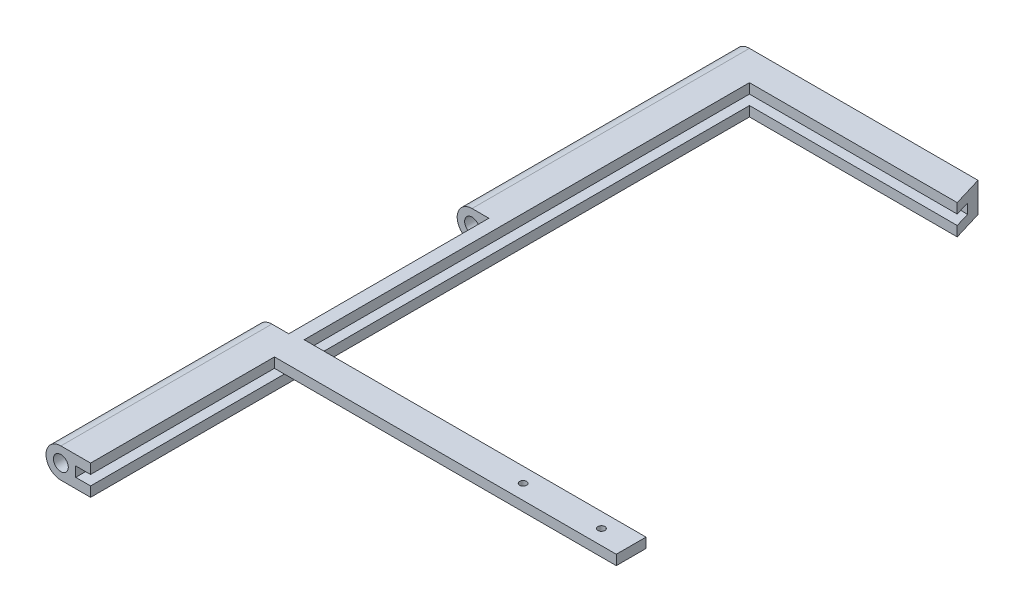
ISO-10303-21;
HEADER;
FILE_DESCRIPTION(('STEP AP214'),'2;1');
FILE_NAME('part.step','',(''),(''),'','','');
FILE_SCHEMA(('AUTOMOTIVE_DESIGN { 1 0 10303 214 1 1 1 1 }'));
ENDSEC;
DATA;
#1=APPLICATION_CONTEXT('core data for automotive mechanical design processes');
#2=APPLICATION_PROTOCOL_DEFINITION('international standard','automotive_design',2000,#1);
#3=PRODUCT_CONTEXT('',#1,'mechanical');
#4=PRODUCT('Part','Part','',(#3));
#5=PRODUCT_RELATED_PRODUCT_CATEGORY('part','',(#4));
#6=PRODUCT_DEFINITION_FORMATION('','',#4);
#7=PRODUCT_DEFINITION_CONTEXT('part definition',#1,'design');
#8=PRODUCT_DEFINITION('design','',#6,#7);
#9=PRODUCT_DEFINITION_SHAPE('','',#8);
#10=(LENGTH_UNIT() NAMED_UNIT(*) SI_UNIT(.MILLI.,.METRE.));
#11=(NAMED_UNIT(*) PLANE_ANGLE_UNIT() SI_UNIT($,.RADIAN.));
#12=(NAMED_UNIT(*) SI_UNIT($,.STERADIAN.) SOLID_ANGLE_UNIT());
#13=UNCERTAINTY_MEASURE_WITH_UNIT(LENGTH_MEASURE(1.E-05),#10,'distance_accuracy_value','');
#14=(GEOMETRIC_REPRESENTATION_CONTEXT(3) GLOBAL_UNCERTAINTY_ASSIGNED_CONTEXT((#13)) GLOBAL_UNIT_ASSIGNED_CONTEXT((#10,
#11,#12)) REPRESENTATION_CONTEXT('',''));
#15=CARTESIAN_POINT('',(0.,0.,0.));
#16=DIRECTION('',(0.,0.,1.));
#17=DIRECTION('',(1.,0.,0.));
#18=AXIS2_PLACEMENT_3D('',#15,#16,#17);
#19=CARTESIAN_POINT('',(0.,0.,3.));
#20=DIRECTION('',(0.,0.,1.));
#21=DIRECTION('',(1.,0.,0.));
#22=AXIS2_PLACEMENT_3D('',#19,#20,#21);
#23=PLANE('',#22);
#24=DIRECTION('',(-1.,0.,0.));
#25=VECTOR('',#24,1.);
#26=CARTESIAN_POINT('',(-0.199999999999998,1.99999999999999,3.));
#27=LINE('',#26,#25);
#28=CARTESIAN_POINT('',(22.2701570676023,2.,3.));
#29=VERTEX_POINT('',#28);
#30=CARTESIAN_POINT('',(1.3,2.,3.));
#31=VERTEX_POINT('',#30);
#32=EDGE_CURVE('E432',#29,#31,#27,.T.);
#33=ORIENTED_EDGE('',*,*,#32,.F.);
#34=DIRECTION('',(0.,1.,0.));
#35=VECTOR('',#34,1.);
#36=CARTESIAN_POINT('',(22.2701570676023,0.,3.));
#37=LINE('',#36,#35);
#38=CARTESIAN_POINT('',(22.2701570676023,3.,3.));
#39=VERTEX_POINT('',#38);
#40=EDGE_CURVE('E305',#29,#39,#37,.T.);
#41=ORIENTED_EDGE('',*,*,#40,.T.);
#42=DIRECTION('',(1.,0.,0.));
#43=VECTOR('',#42,1.);
#44=CARTESIAN_POINT('',(0.,3.,3.));
#45=LINE('',#44,#43);
#46=CARTESIAN_POINT('',(1.3,3.,3.));
#47=VERTEX_POINT('',#46);
#48=EDGE_CURVE('E309',#47,#39,#45,.T.);
#49=ORIENTED_EDGE('',*,*,#48,.F.);
#50=DIRECTION('',(0.,1.,0.));
#51=VECTOR('',#50,1.);
#52=CARTESIAN_POINT('',(1.3,0.,3.));
#53=LINE('',#52,#51);
#54=EDGE_CURVE('E290',#31,#47,#53,.T.);
#55=ORIENTED_EDGE('',*,*,#54,.F.);
#56=EDGE_LOOP('',(#33,#41,#49,#55));
#57=FACE_BOUND('',#56,.T.);
#58=ADVANCED_FACE('F46',(#57),#23,.T.);
#59=CARTESIAN_POINT('',(1.3,0.,0.));
#60=DIRECTION('',(1.,0.,0.));
#61=DIRECTION('',(0.,0.,-1.));
#62=AXIS2_PLACEMENT_3D('',#59,#60,#61);
#63=PLANE('',#62);
#64=DIRECTION('',(0.,0.,-1.));
#65=VECTOR('',#64,1.);
#66=CARTESIAN_POINT('',(1.3,2.,0.));
#67=LINE('',#66,#65);
#68=CARTESIAN_POINT('',(1.3,1.99999999999999,69.5));
#69=VERTEX_POINT('',#68);
#70=CARTESIAN_POINT('',(1.3,1.99999999999999,50.9417859642579));
#71=VERTEX_POINT('',#70);
#72=EDGE_CURVE('E275',#69,#71,#67,.T.);
#73=ORIENTED_EDGE('',*,*,#72,.T.);
#74=DIRECTION('',(0.,-1.,0.));
#75=VECTOR('',#74,1.);
#76=CARTESIAN_POINT('',(1.3,3.,50.9417859642579));
#77=LINE('',#76,#75);
#78=CARTESIAN_POINT('',(1.3,3.,50.9417859642579));
#79=VERTEX_POINT('',#78);
#80=EDGE_CURVE('E246',#79,#71,#77,.T.);
#81=ORIENTED_EDGE('',*,*,#80,.F.);
#82=DIRECTION('',(0.,0.,-1.));
#83=VECTOR('',#82,1.);
#84=CARTESIAN_POINT('',(1.3,3.,0.));
#85=LINE('',#84,#83);
#86=CARTESIAN_POINT('',(1.3,3.,69.5));
#87=VERTEX_POINT('',#86);
#88=EDGE_CURVE('E298',#87,#79,#85,.T.);
#89=ORIENTED_EDGE('',*,*,#88,.F.);
#90=DIRECTION('',(0.,1.,0.));
#91=VECTOR('',#90,1.);
#92=CARTESIAN_POINT('',(1.3,0.,69.5));
#93=LINE('',#92,#91);
#94=EDGE_CURVE('E217',#69,#87,#93,.T.);
#95=ORIENTED_EDGE('',*,*,#94,.F.);
#96=EDGE_LOOP('',(#73,#81,#89,#95));
#97=FACE_BOUND('',#96,.T.);
#98=ADVANCED_FACE('F416',(#97),#63,.T.);
#99=CARTESIAN_POINT('',(1.3,3.,47.9417859642579));
#100=VERTEX_POINT('',#99);
#101=EDGE_CURVE('E68',#100,#47,#85,.T.);
#102=ORIENTED_EDGE('',*,*,#101,.F.);
#103=DIRECTION('',(0.,1.,0.));
#104=VECTOR('',#103,1.);
#105=CARTESIAN_POINT('',(1.3,3.,47.9417859642579));
#106=LINE('',#105,#104);
#107=CARTESIAN_POINT('',(1.3,1.99999999999999,47.9417859642579));
#108=VERTEX_POINT('',#107);
#109=EDGE_CURVE('E233',#108,#100,#106,.T.);
#110=ORIENTED_EDGE('',*,*,#109,.F.);
#111=EDGE_CURVE('E274',#108,#31,#67,.T.);
#112=ORIENTED_EDGE('',*,*,#111,.T.);
#113=ORIENTED_EDGE('',*,*,#54,.T.);
#114=EDGE_LOOP('',(#102,#110,#112,#113));
#115=FACE_BOUND('',#114,.T.);
#116=ADVANCED_FACE('F449',(#115),#63,.T.);
#117=CARTESIAN_POINT('',(0.,0.,48.2));
#118=DIRECTION('',(0.,0.,-1.));
#119=DIRECTION('',(-1.,0.,0.));
#120=AXIS2_PLACEMENT_3D('',#117,#118,#119);
#121=PLANE('',#120);
#122=CARTESIAN_POINT('',(-1.7,1.5,48.2));
#123=DIRECTION('',(0.,0.,-1.));
#124=DIRECTION('',(-1.,0.,0.));
#125=AXIS2_PLACEMENT_3D('',#122,#123,#124);
#126=CIRCLE('',#125,0.75);
#127=CARTESIAN_POINT('',(-2.45,1.5,48.2));
#128=VERTEX_POINT('',#127);
#129=EDGE_CURVE('E345',#128,#128,#126,.F.);
#130=ORIENTED_EDGE('',*,*,#129,.T.);
#131=EDGE_LOOP('',(#130));
#132=FACE_BOUND('',#131,.T.);
#133=DIRECTION('',(0.,1.,0.));
#134=VECTOR('',#133,1.);
#135=CARTESIAN_POINT('',(0.,0.,48.2));
#136=LINE('',#135,#134);
#137=CARTESIAN_POINT('',(0.,1.99999999999999,48.2));
#138=VERTEX_POINT('',#137);
#139=CARTESIAN_POINT('',(0.,3.,48.2));
#140=VERTEX_POINT('',#139);
#141=EDGE_CURVE('E327',#138,#140,#136,.T.);
#142=ORIENTED_EDGE('',*,*,#141,.F.);
#143=DIRECTION('',(-1.,0.,0.));
#144=VECTOR('',#143,1.);
#145=CARTESIAN_POINT('',(0.,1.99999999999999,48.2));
#146=LINE('',#145,#144);
#147=CARTESIAN_POINT('',(-0.199999999999999,1.99999999999999,48.2));
#148=VERTEX_POINT('',#147);
#149=EDGE_CURVE('E262',#138,#148,#146,.T.);
#150=ORIENTED_EDGE('',*,*,#149,.T.);
#151=DIRECTION('',(0.,-1.,0.));
#152=VECTOR('',#151,1.);
#153=CARTESIAN_POINT('',(-0.199999999999999,0.,48.2));
#154=LINE('',#153,#152);
#155=CARTESIAN_POINT('',(-0.199999999999999,0.999999999999994,48.2));
#156=VERTEX_POINT('',#155);
#157=EDGE_CURVE('E265',#148,#156,#154,.T.);
#158=ORIENTED_EDGE('',*,*,#157,.T.);
#159=DIRECTION('',(-1.,0.,0.));
#160=VECTOR('',#159,1.);
#161=CARTESIAN_POINT('',(0.,0.999999999999994,48.2));
#162=LINE('',#161,#160);
#163=CARTESIAN_POINT('',(0.,0.999999999999994,48.2));
#164=VERTEX_POINT('',#163);
#165=EDGE_CURVE('E260',#164,#156,#162,.T.);
#166=ORIENTED_EDGE('',*,*,#165,.F.);
#167=CARTESIAN_POINT('',(0.,0.,48.2));
#168=VERTEX_POINT('',#167);
#169=EDGE_CURVE('E335',#168,#164,#136,.T.);
#170=ORIENTED_EDGE('',*,*,#169,.F.);
#171=DIRECTION('',(-1.,0.,0.));
#172=VECTOR('',#171,1.);
#173=CARTESIAN_POINT('',(0.,0.,48.2));
#174=LINE('',#173,#172);
#175=CARTESIAN_POINT('',(-1.7,0.,48.2));
#176=VERTEX_POINT('',#175);
#177=EDGE_CURVE('E317',#168,#176,#174,.T.);
#178=ORIENTED_EDGE('',*,*,#177,.T.);
#179=CARTESIAN_POINT('',(-1.7,1.5,48.2));
#180=DIRECTION('',(0.,0.,-1.));
#181=DIRECTION('',(-1.,0.,0.));
#182=AXIS2_PLACEMENT_3D('',#179,#180,#181);
#183=CIRCLE('',#182,1.5);
#184=CARTESIAN_POINT('',(-1.7,3.,48.2));
#185=VERTEX_POINT('',#184);
#186=EDGE_CURVE('E346',#185,#176,#183,.F.);
#187=ORIENTED_EDGE('',*,*,#186,.F.);
#188=DIRECTION('',(-1.,0.,0.));
#189=VECTOR('',#188,1.);
#190=CARTESIAN_POINT('',(0.,3.,48.2));
#191=LINE('',#190,#189);
#192=EDGE_CURVE('E294',#140,#185,#191,.T.);
#193=ORIENTED_EDGE('',*,*,#192,.F.);
#194=EDGE_LOOP('',(#142,#150,#158,#166,#170,#178,#187,#193));
#195=FACE_BOUND('',#194,.T.);
#196=ADVANCED_FACE('F476',(#132,#195),#121,.T.);
#197=CARTESIAN_POINT('',(0.,0.,48.2));
#198=DIRECTION('',(1.,0.,0.));
#199=DIRECTION('',(0.,0.,-1.));
#200=AXIS2_PLACEMENT_3D('',#197,#198,#199);
#201=PLANE('',#200);
#202=DIRECTION('',(0.,0.,-1.));
#203=VECTOR('',#202,1.);
#204=CARTESIAN_POINT('',(0.,1.99999999999999,48.2));
#205=LINE('',#204,#203);
#206=CARTESIAN_POINT('',(0.,2.,28.));
#207=VERTEX_POINT('',#206);
#208=EDGE_CURVE('E277',#138,#207,#205,.T.);
#209=ORIENTED_EDGE('',*,*,#208,.F.);
#210=ORIENTED_EDGE('',*,*,#141,.T.);
#211=DIRECTION('',(0.,0.,-1.));
#212=VECTOR('',#211,1.);
#213=CARTESIAN_POINT('',(0.,3.,48.2));
#214=LINE('',#213,#212);
#215=CARTESIAN_POINT('',(0.,3.,28.));
#216=VERTEX_POINT('',#215);
#217=EDGE_CURVE('E321',#140,#216,#214,.T.);
#218=ORIENTED_EDGE('',*,*,#217,.T.);
#219=DIRECTION('',(0.,1.,0.));
#220=VECTOR('',#219,1.);
#221=CARTESIAN_POINT('',(0.,0.,28.));
#222=LINE('',#221,#220);
#223=EDGE_CURVE('E338',#207,#216,#222,.T.);
#224=ORIENTED_EDGE('',*,*,#223,.F.);
#225=EDGE_LOOP('',(#209,#210,#218,#224));
#226=FACE_BOUND('',#225,.T.);
#227=ADVANCED_FACE('F472',(#226),#201,.F.);
#228=CARTESIAN_POINT('',(38.8,0.,69.5));
#229=DIRECTION('',(0.,0.,-1.));
#230=DIRECTION('',(-1.,0.,0.));
#231=AXIS2_PLACEMENT_3D('',#228,#229,#230);
#232=PLANE('',#231);
#233=CARTESIAN_POINT('',(-1.7,1.5,69.5));
#234=DIRECTION('',(0.,0.,-1.));
#235=DIRECTION('',(-1.,0.,0.));
#236=AXIS2_PLACEMENT_3D('',#233,#234,#235);
#237=CIRCLE('',#236,0.75);
#238=CARTESIAN_POINT('',(-2.45,1.5,69.5));
#239=VERTEX_POINT('',#238);
#240=EDGE_CURVE('E348',#239,#239,#237,.F.);
#241=ORIENTED_EDGE('',*,*,#240,.F.);
#242=EDGE_LOOP('',(#241));
#243=FACE_BOUND('',#242,.T.);
#244=DIRECTION('',(-1.,0.,0.));
#245=VECTOR('',#244,1.);
#246=CARTESIAN_POINT('',(60.8227155455453,1.99999999999999,69.5));
#247=LINE('',#246,#245);
#248=CARTESIAN_POINT('',(-0.199999999999998,1.99999999999999,69.5));
#249=VERTEX_POINT('',#248);
#250=EDGE_CURVE('E257',#69,#249,#247,.T.);
#251=ORIENTED_EDGE('',*,*,#250,.F.);
#252=ORIENTED_EDGE('',*,*,#94,.T.);
#253=DIRECTION('',(-1.,0.,0.));
#254=VECTOR('',#253,1.);
#255=CARTESIAN_POINT('',(38.8,3.,69.5));
#256=LINE('',#255,#254);
#257=CARTESIAN_POINT('',(-1.7,3.,69.5));
#258=VERTEX_POINT('',#257);
#259=EDGE_CURVE('E291',#87,#258,#256,.T.);
#260=ORIENTED_EDGE('',*,*,#259,.T.);
#261=CARTESIAN_POINT('',(-1.7,1.5,69.5));
#262=DIRECTION('',(0.,0.,-1.));
#263=DIRECTION('',(-1.,0.,0.));
#264=AXIS2_PLACEMENT_3D('',#261,#262,#263);
#265=CIRCLE('',#264,1.5);
#266=CARTESIAN_POINT('',(-1.7,0.,69.5));
#267=VERTEX_POINT('',#266);
#268=EDGE_CURVE('E349',#258,#267,#265,.F.);
#269=ORIENTED_EDGE('',*,*,#268,.T.);
#270=DIRECTION('',(-1.,0.,0.));
#271=VECTOR('',#270,1.);
#272=CARTESIAN_POINT('',(38.8,0.,69.5));
#273=LINE('',#272,#271);
#274=CARTESIAN_POINT('',(1.3,0.,69.5));
#275=VERTEX_POINT('',#274);
#276=EDGE_CURVE('E295',#275,#267,#273,.T.);
#277=ORIENTED_EDGE('',*,*,#276,.F.);
#278=CARTESIAN_POINT('',(1.3,0.999999999999995,69.5));
#279=VERTEX_POINT('',#278);
#280=EDGE_CURVE('E299',#275,#279,#93,.T.);
#281=ORIENTED_EDGE('',*,*,#280,.T.);
#282=DIRECTION('',(-1.,0.,0.));
#283=VECTOR('',#282,1.);
#284=CARTESIAN_POINT('',(60.8227155455453,0.999999999999995,69.5));
#285=LINE('',#284,#283);
#286=CARTESIAN_POINT('',(-0.199999999999998,0.999999999999995,69.5));
#287=VERTEX_POINT('',#286);
#288=EDGE_CURVE('E254',#279,#287,#285,.T.);
#289=ORIENTED_EDGE('',*,*,#288,.T.);
#290=DIRECTION('',(0.,-1.,0.));
#291=VECTOR('',#290,1.);
#292=CARTESIAN_POINT('',(-0.199999999999998,0.,69.5));
#293=LINE('',#292,#291);
#294=EDGE_CURVE('E249',#249,#287,#293,.T.);
#295=ORIENTED_EDGE('',*,*,#294,.F.);
#296=EDGE_LOOP('',(#251,#252,#260,#269,#277,#281,#289,#295));
#297=FACE_BOUND('',#296,.T.);
#298=ADVANCED_FACE('F423',(#243,#297),#232,.F.);
#299=CARTESIAN_POINT('',(0.,3.,0.));
#300=DIRECTION('',(0.,1.,0.));
#301=DIRECTION('',(0.,0.,1.));
#302=AXIS2_PLACEMENT_3D('',#299,#300,#301);
#303=PLANE('',#302);
#304=DIRECTION('',(0.,0.,1.));
#305=VECTOR('',#304,1.);
#306=CARTESIAN_POINT('',(35.8,3.,47.9417859642579));
#307=LINE('',#306,#305);
#308=CARTESIAN_POINT('',(35.8,3.,47.9417859642579));
#309=VERTEX_POINT('',#308);
#310=CARTESIAN_POINT('',(35.8,3.,50.9417859642579));
#311=VERTEX_POINT('',#310);
#312=EDGE_CURVE('E209',#309,#311,#307,.T.);
#313=ORIENTED_EDGE('',*,*,#312,.F.);
#314=DIRECTION('',(1.,0.,0.));
#315=VECTOR('',#314,1.);
#316=CARTESIAN_POINT('',(-1.86227766016838,3.,47.9417859642579));
#317=LINE('',#316,#315);
#318=EDGE_CURVE('E224',#100,#309,#317,.T.);
#319=ORIENTED_EDGE('',*,*,#318,.F.);
#320=ORIENTED_EDGE('',*,*,#101,.T.);
#321=ORIENTED_EDGE('',*,*,#48,.T.);
#322=DIRECTION('',(0.288272472485392,0.,0.957548422591337));
#323=VECTOR('',#322,1.);
#324=CARTESIAN_POINT('',(20.3323729813987,3.,-3.43669539123599));
#325=LINE('',#324,#323);
#326=CARTESIAN_POINT('',(21.3669991728655,3.,0.));
#327=VERTEX_POINT('',#326);
#328=EDGE_CURVE('E230',#327,#39,#325,.T.);
#329=ORIENTED_EDGE('',*,*,#328,.F.);
#330=DIRECTION('',(-1.,0.,0.));
#331=VECTOR('',#330,1.);
#332=CARTESIAN_POINT('',(24.5,3.,0.));
#333=LINE('',#332,#331);
#334=CARTESIAN_POINT('',(-1.7,3.,0.));
#335=VERTEX_POINT('',#334);
#336=EDGE_CURVE('E365',#327,#335,#333,.T.);
#337=ORIENTED_EDGE('',*,*,#336,.T.);
#338=DIRECTION('',(0.,0.,-1.));
#339=VECTOR('',#338,1.);
#340=CARTESIAN_POINT('',(-1.7,3.,77.3863424398923));
#341=LINE('',#340,#339);
#342=CARTESIAN_POINT('',(-1.7,3.,28.));
#343=VERTEX_POINT('',#342);
#344=EDGE_CURVE('E358',#343,#335,#341,.T.);
#345=ORIENTED_EDGE('',*,*,#344,.F.);
#346=DIRECTION('',(-1.,0.,0.));
#347=VECTOR('',#346,1.);
#348=CARTESIAN_POINT('',(0.,3.,28.));
#349=LINE('',#348,#347);
#350=EDGE_CURVE('E330',#216,#343,#349,.T.);
#351=ORIENTED_EDGE('',*,*,#350,.F.);
#352=ORIENTED_EDGE('',*,*,#217,.F.);
#353=ORIENTED_EDGE('',*,*,#192,.T.);
#354=EDGE_CURVE('E361',#258,#185,#341,.T.);
#355=ORIENTED_EDGE('',*,*,#354,.F.);
#356=ORIENTED_EDGE('',*,*,#259,.F.);
#357=ORIENTED_EDGE('',*,*,#88,.T.);
#358=DIRECTION('',(1.,0.,0.));
#359=VECTOR('',#358,1.);
#360=CARTESIAN_POINT('',(-1.86227766016838,3.,50.9417859642579));
#361=LINE('',#360,#359);
#362=EDGE_CURVE('E227',#79,#311,#361,.T.);
#363=ORIENTED_EDGE('',*,*,#362,.T.);
#364=EDGE_LOOP('',(#313,#319,#320,#321,#329,#337,#345,#351,#352,#353,#355,#356,#357,#363));
#365=FACE_BOUND('',#364,.T.);
#366=CARTESIAN_POINT('',(32.8,3.,49.4417859642579));
#367=DIRECTION('',(0.,1.,0.));
#368=DIRECTION('',(0.,0.,1.));
#369=AXIS2_PLACEMENT_3D('',#366,#367,#368);
#370=CIRCLE('',#369,0.350000000000002);
#371=CARTESIAN_POINT('',(32.8,3.,49.7917859642579));
#372=VERTEX_POINT('',#371);
#373=EDGE_CURVE('E378',#372,#372,#370,.T.);
#374=ORIENTED_EDGE('',*,*,#373,.F.);
#375=EDGE_LOOP('',(#374));
#376=FACE_BOUND('',#375,.T.);
#377=CARTESIAN_POINT('',(24.9,3.,49.4417859642579));
#378=DIRECTION('',(0.,1.,0.));
#379=DIRECTION('',(0.,0.,1.));
#380=AXIS2_PLACEMENT_3D('',#377,#378,#379);
#381=CIRCLE('',#380,0.350000000000008);
#382=CARTESIAN_POINT('',(24.9,3.,49.7917859642579));
#383=VERTEX_POINT('',#382);
#384=EDGE_CURVE('E400',#383,#383,#381,.T.);
#385=ORIENTED_EDGE('',*,*,#384,.F.);
#386=EDGE_LOOP('',(#385));
#387=FACE_BOUND('',#386,.T.);
#388=ADVANCED_FACE('F222',(#365,#376,#387),#303,.T.);
#389=CARTESIAN_POINT('',(0.,0.,0.));
#390=DIRECTION('',(0.,1.,0.));
#391=DIRECTION('',(0.,0.,1.));
#392=AXIS2_PLACEMENT_3D('',#389,#390,#391);
#393=PLANE('',#392);
#394=DIRECTION('',(-1.,0.,0.));
#395=VECTOR('',#394,1.);
#396=CARTESIAN_POINT('',(24.5,0.,0.));
#397=LINE('',#396,#395);
#398=CARTESIAN_POINT('',(21.3669991728655,0.,0.));
#399=VERTEX_POINT('',#398);
#400=CARTESIAN_POINT('',(-1.7,0.,0.));
#401=VERTEX_POINT('',#400);
#402=EDGE_CURVE('E367',#399,#401,#397,.T.);
#403=ORIENTED_EDGE('',*,*,#402,.F.);
#404=DIRECTION('',(0.288272472485392,0.,0.957548422591337));
#405=VECTOR('',#404,1.);
#406=CARTESIAN_POINT('',(20.3323729813987,0.,-3.43669539123599));
#407=LINE('',#406,#405);
#408=CARTESIAN_POINT('',(22.2701570676023,0.,3.));
#409=VERTEX_POINT('',#408);
#410=EDGE_CURVE('E229',#399,#409,#407,.T.);
#411=ORIENTED_EDGE('',*,*,#410,.T.);
#412=DIRECTION('',(1.,0.,0.));
#413=VECTOR('',#412,1.);
#414=CARTESIAN_POINT('',(0.,0.,3.));
#415=LINE('',#414,#413);
#416=CARTESIAN_POINT('',(1.3,0.,3.));
#417=VERTEX_POINT('',#416);
#418=EDGE_CURVE('E301',#417,#409,#415,.T.);
#419=ORIENTED_EDGE('',*,*,#418,.F.);
#420=DIRECTION('',(0.,0.,-1.));
#421=VECTOR('',#420,1.);
#422=CARTESIAN_POINT('',(1.3,0.,0.));
#423=LINE('',#422,#421);
#424=EDGE_CURVE('E312',#275,#417,#423,.T.);
#425=ORIENTED_EDGE('',*,*,#424,.F.);
#426=ORIENTED_EDGE('',*,*,#276,.T.);
#427=DIRECTION('',(0.,0.,-1.));
#428=VECTOR('',#427,1.);
#429=CARTESIAN_POINT('',(-1.7,0.,77.3863424398923));
#430=LINE('',#429,#428);
#431=EDGE_CURVE('E362',#267,#176,#430,.T.);
#432=ORIENTED_EDGE('',*,*,#431,.T.);
#433=ORIENTED_EDGE('',*,*,#177,.F.);
#434=DIRECTION('',(0.,0.,-1.));
#435=VECTOR('',#434,1.);
#436=CARTESIAN_POINT('',(0.,0.,48.2));
#437=LINE('',#436,#435);
#438=CARTESIAN_POINT('',(0.,0.,28.));
#439=VERTEX_POINT('',#438);
#440=EDGE_CURVE('E324',#168,#439,#437,.T.);
#441=ORIENTED_EDGE('',*,*,#440,.T.);
#442=DIRECTION('',(-1.,0.,0.));
#443=VECTOR('',#442,1.);
#444=CARTESIAN_POINT('',(0.,0.,28.));
#445=LINE('',#444,#443);
#446=CARTESIAN_POINT('',(-1.7,0.,28.));
#447=VERTEX_POINT('',#446);
#448=EDGE_CURVE('E320',#439,#447,#445,.T.);
#449=ORIENTED_EDGE('',*,*,#448,.T.);
#450=EDGE_CURVE('E357',#447,#401,#430,.T.);
#451=ORIENTED_EDGE('',*,*,#450,.T.);
#452=EDGE_LOOP('',(#403,#411,#419,#425,#426,#432,#433,#441,#449,#451));
#453=FACE_BOUND('',#452,.T.);
#454=ADVANCED_FACE('F483',(#453),#393,.F.);
#455=CARTESIAN_POINT('',(-1.7,1.5,77.3863424398923));
#456=DIRECTION('',(0.,0.,-1.));
#457=DIRECTION('',(-1.,0.,0.));
#458=AXIS2_PLACEMENT_3D('',#455,#456,#457);
#459=CYLINDRICAL_SURFACE('',#458,1.5);
#460=ORIENTED_EDGE('',*,*,#268,.F.);
#461=ORIENTED_EDGE('',*,*,#354,.T.);
#462=ORIENTED_EDGE('',*,*,#186,.T.);
#463=ORIENTED_EDGE('',*,*,#431,.F.);
#464=EDGE_LOOP('',(#460,#461,#462,#463));
#465=FACE_BOUND('',#464,.T.);
#466=ADVANCED_FACE('F478',(#465),#459,.T.);
#467=CARTESIAN_POINT('',(24.5,3.,0.));
#468=DIRECTION('',(0.,0.,1.));
#469=DIRECTION('',(1.,0.,0.));
#470=AXIS2_PLACEMENT_3D('',#467,#468,#469);
#471=PLANE('',#470);
#472=ORIENTED_EDGE('',*,*,#336,.F.);
#473=DIRECTION('',(0.,-1.,0.));
#474=VECTOR('',#473,1.);
#475=CARTESIAN_POINT('',(21.3669991728655,3.,0.));
#476=LINE('',#475,#474);
#477=EDGE_CURVE('E429',#327,#399,#476,.T.);
#478=ORIENTED_EDGE('',*,*,#477,.T.);
#479=ORIENTED_EDGE('',*,*,#402,.T.);
#480=CARTESIAN_POINT('',(-1.7,1.5,0.));
#481=DIRECTION('',(0.,0.,-1.));
#482=DIRECTION('',(-1.,0.,0.));
#483=AXIS2_PLACEMENT_3D('',#480,#481,#482);
#484=CIRCLE('',#483,1.5);
#485=EDGE_CURVE('E351',#401,#335,#484,.T.);
#486=ORIENTED_EDGE('',*,*,#485,.T.);
#487=EDGE_LOOP('',(#472,#478,#479,#486));
#488=FACE_BOUND('',#487,.T.);
#489=CARTESIAN_POINT('',(-1.7,1.5,0.));
#490=DIRECTION('',(0.,0.,-1.));
#491=DIRECTION('',(-1.,0.,0.));
#492=AXIS2_PLACEMENT_3D('',#489,#490,#491);
#493=CIRCLE('',#492,0.75);
#494=CARTESIAN_POINT('',(-2.45,1.5,0.));
#495=VERTEX_POINT('',#494);
#496=EDGE_CURVE('E354',#495,#495,#493,.T.);
#497=ORIENTED_EDGE('',*,*,#496,.F.);
#498=EDGE_LOOP('',(#497));
#499=FACE_BOUND('',#498,.T.);
#500=ADVANCED_FACE('F48',(#488,#499),#471,.F.);
#501=CARTESIAN_POINT('',(-1.7,1.5,28.));
#502=DIRECTION('',(0.,0.,-1.));
#503=DIRECTION('',(-1.,0.,0.));
#504=AXIS2_PLACEMENT_3D('',#501,#502,#503);
#505=CIRCLE('',#504,1.5);
#506=EDGE_CURVE('E343',#343,#447,#505,.F.);
#507=ORIENTED_EDGE('',*,*,#506,.F.);
#508=ORIENTED_EDGE('',*,*,#344,.T.);
#509=ORIENTED_EDGE('',*,*,#485,.F.);
#510=ORIENTED_EDGE('',*,*,#450,.F.);
#511=EDGE_LOOP('',(#507,#508,#509,#510));
#512=FACE_BOUND('',#511,.T.);
#513=ADVANCED_FACE('F461',(#512),#459,.T.);
#514=CARTESIAN_POINT('',(-1.7,1.5,77.3863424398923));
#515=DIRECTION('',(0.,0.,-1.));
#516=DIRECTION('',(-1.,0.,0.));
#517=AXIS2_PLACEMENT_3D('',#514,#515,#516);
#518=CYLINDRICAL_SURFACE('',#517,0.75);
#519=CARTESIAN_POINT('',(-1.7,1.5,28.));
#520=DIRECTION('',(0.,0.,-1.));
#521=DIRECTION('',(-1.,0.,0.));
#522=AXIS2_PLACEMENT_3D('',#519,#520,#521);
#523=CIRCLE('',#522,0.75);
#524=CARTESIAN_POINT('',(-2.45,1.5,28.));
#525=VERTEX_POINT('',#524);
#526=EDGE_CURVE('E342',#525,#525,#523,.F.);
#527=ORIENTED_EDGE('',*,*,#526,.T.);
#528=EDGE_LOOP('',(#527));
#529=FACE_BOUND('',#528,.T.);
#530=ORIENTED_EDGE('',*,*,#496,.T.);
#531=EDGE_LOOP('',(#530));
#532=FACE_BOUND('',#531,.T.);
#533=ADVANCED_FACE('F543',(#529,#532),#518,.F.);
#534=CARTESIAN_POINT('',(0.,0.,28.));
#535=DIRECTION('',(0.,0.,-1.));
#536=DIRECTION('',(-1.,0.,0.));
#537=AXIS2_PLACEMENT_3D('',#534,#535,#536);
#538=PLANE('',#537);
#539=CARTESIAN_POINT('',(0.,0.999999999999996,28.));
#540=VERTEX_POINT('',#539);
#541=EDGE_CURVE('E339',#439,#540,#222,.T.);
#542=ORIENTED_EDGE('',*,*,#541,.T.);
#543=DIRECTION('',(-1.,0.,0.));
#544=VECTOR('',#543,1.);
#545=CARTESIAN_POINT('',(0.,0.999999999999996,28.));
#546=LINE('',#545,#544);
#547=CARTESIAN_POINT('',(-0.199999999999999,0.999999999999996,28.));
#548=VERTEX_POINT('',#547);
#549=EDGE_CURVE('E287',#540,#548,#546,.T.);
#550=ORIENTED_EDGE('',*,*,#549,.T.);
#551=DIRECTION('',(0.,-1.,0.));
#552=VECTOR('',#551,1.);
#553=CARTESIAN_POINT('',(-0.199999999999999,0.,28.));
#554=LINE('',#553,#552);
#555=CARTESIAN_POINT('',(-0.199999999999999,2.,28.));
#556=VERTEX_POINT('',#555);
#557=EDGE_CURVE('E54',#556,#548,#554,.T.);
#558=ORIENTED_EDGE('',*,*,#557,.F.);
#559=DIRECTION('',(-1.,0.,0.));
#560=VECTOR('',#559,1.);
#561=CARTESIAN_POINT('',(0.,2.,28.));
#562=LINE('',#561,#560);
#563=EDGE_CURVE('E279',#207,#556,#562,.T.);
#564=ORIENTED_EDGE('',*,*,#563,.F.);
#565=ORIENTED_EDGE('',*,*,#223,.T.);
#566=ORIENTED_EDGE('',*,*,#350,.T.);
#567=ORIENTED_EDGE('',*,*,#506,.T.);
#568=ORIENTED_EDGE('',*,*,#448,.F.);
#569=EDGE_LOOP('',(#542,#550,#558,#564,#565,#566,#567,#568));
#570=FACE_BOUND('',#569,.T.);
#571=ORIENTED_EDGE('',*,*,#526,.F.);
#572=EDGE_LOOP('',(#571));
#573=FACE_BOUND('',#572,.T.);
#574=ADVANCED_FACE('F465',(#570,#573),#538,.F.);
#575=ORIENTED_EDGE('',*,*,#169,.T.);
#576=DIRECTION('',(0.,0.,-1.));
#577=VECTOR('',#576,1.);
#578=CARTESIAN_POINT('',(0.,0.999999999999994,48.2));
#579=LINE('',#578,#577);
#580=EDGE_CURVE('E284',#164,#540,#579,.T.);
#581=ORIENTED_EDGE('',*,*,#580,.T.);
#582=ORIENTED_EDGE('',*,*,#541,.F.);
#583=ORIENTED_EDGE('',*,*,#440,.F.);
#584=EDGE_LOOP('',(#575,#581,#582,#583));
#585=FACE_BOUND('',#584,.T.);
#586=ADVANCED_FACE('F500',(#585),#201,.F.);
#587=ORIENTED_EDGE('',*,*,#240,.T.);
#588=EDGE_LOOP('',(#587));
#589=FACE_BOUND('',#588,.T.);
#590=ORIENTED_EDGE('',*,*,#129,.F.);
#591=EDGE_LOOP('',(#590));
#592=FACE_BOUND('',#591,.T.);
#593=ADVANCED_FACE('F536',(#589,#592),#518,.F.);
#594=DIRECTION('',(0.,0.,-1.));
#595=VECTOR('',#594,1.);
#596=CARTESIAN_POINT('',(1.3,1.,0.));
#597=LINE('',#596,#595);
#598=CARTESIAN_POINT('',(1.3,0.999999999999995,3.));
#599=VERTEX_POINT('',#598);
#600=EDGE_CURVE('E281',#279,#599,#597,.T.);
#601=ORIENTED_EDGE('',*,*,#600,.F.);
#602=ORIENTED_EDGE('',*,*,#280,.F.);
#603=ORIENTED_EDGE('',*,*,#424,.T.);
#604=EDGE_CURVE('E306',#417,#599,#53,.T.);
#605=ORIENTED_EDGE('',*,*,#604,.T.);
#606=EDGE_LOOP('',(#601,#602,#603,#605));
#607=FACE_BOUND('',#606,.T.);
#608=ADVANCED_FACE('F488',(#607),#63,.T.);
#609=DIRECTION('',(1.,0.,0.));
#610=VECTOR('',#609,1.);
#611=CARTESIAN_POINT('',(-0.199999999999998,0.999999999999995,3.));
#612=LINE('',#611,#610);
#613=CARTESIAN_POINT('',(22.2701570676023,0.999999999999998,3.));
#614=VERTEX_POINT('',#613);
#615=EDGE_CURVE('E428',#599,#614,#612,.T.);
#616=ORIENTED_EDGE('',*,*,#615,.F.);
#617=ORIENTED_EDGE('',*,*,#604,.F.);
#618=ORIENTED_EDGE('',*,*,#418,.T.);
#619=EDGE_CURVE('E218',#409,#614,#37,.T.);
#620=ORIENTED_EDGE('',*,*,#619,.T.);
#621=EDGE_LOOP('',(#616,#617,#618,#620));
#622=FACE_BOUND('',#621,.T.);
#623=ADVANCED_FACE('F505',(#622),#23,.T.);
#624=CARTESIAN_POINT('',(-0.200000000000001,0.,0.));
#625=DIRECTION('',(1.,0.,0.));
#626=DIRECTION('',(0.,0.,-1.));
#627=AXIS2_PLACEMENT_3D('',#624,#625,#626);
#628=PLANE('',#627);
#629=ORIENTED_EDGE('',*,*,#557,.T.);
#630=DIRECTION('',(0.,0.,1.));
#631=VECTOR('',#630,1.);
#632=CARTESIAN_POINT('',(-0.200000000000001,1.,0.));
#633=LINE('',#632,#631);
#634=CARTESIAN_POINT('',(-0.199999999999998,0.999999999999995,1.5));
#635=VERTEX_POINT('',#634);
#636=EDGE_CURVE('E271',#635,#548,#633,.T.);
#637=ORIENTED_EDGE('',*,*,#636,.F.);
#638=DIRECTION('',(0.,-1.,0.));
#639=VECTOR('',#638,1.);
#640=CARTESIAN_POINT('',(-0.199999999999998,1.99999999999999,1.5));
#641=LINE('',#640,#639);
#642=CARTESIAN_POINT('',(-0.199999999999998,1.99999999999999,1.5));
#643=VERTEX_POINT('',#642);
#644=EDGE_CURVE('E439',#643,#635,#641,.T.);
#645=ORIENTED_EDGE('',*,*,#644,.F.);
#646=DIRECTION('',(0.,0.,1.));
#647=VECTOR('',#646,1.);
#648=CARTESIAN_POINT('',(-0.200000000000001,2.,0.));
#649=LINE('',#648,#647);
#650=EDGE_CURVE('E268',#643,#556,#649,.T.);
#651=ORIENTED_EDGE('',*,*,#650,.T.);
#652=EDGE_LOOP('',(#629,#637,#645,#651));
#653=FACE_BOUND('',#652,.T.);
#654=ADVANCED_FACE('F497',(#653),#628,.T.);
#655=CARTESIAN_POINT('',(77.5329849057445,1.,0.));
#656=DIRECTION('',(0.,-1.,0.));
#657=DIRECTION('',(0.,0.,-1.));
#658=AXIS2_PLACEMENT_3D('',#655,#656,#657);
#659=PLANE('',#658);
#660=ORIENTED_EDGE('',*,*,#615,.T.);
#661=DIRECTION('',(-0.288272472485392,0.,-0.957548422591338));
#662=VECTOR('',#661,1.);
#663=CARTESIAN_POINT('',(26.0344497863055,0.999999999999998,15.5037695201679));
#664=LINE('',#663,#662);
#665=CARTESIAN_POINT('',(21.8185781202339,0.999999999999995,1.5));
#666=VERTEX_POINT('',#665);
#667=EDGE_CURVE('E435',#614,#666,#664,.T.);
#668=ORIENTED_EDGE('',*,*,#667,.T.);
#669=DIRECTION('',(1.,0.,0.));
#670=VECTOR('',#669,1.);
#671=CARTESIAN_POINT('',(-0.199999999999998,0.999999999999995,1.5));
#672=LINE('',#671,#670);
#673=EDGE_CURVE('E406',#635,#666,#672,.T.);
#674=ORIENTED_EDGE('',*,*,#673,.F.);
#675=ORIENTED_EDGE('',*,*,#636,.T.);
#676=ORIENTED_EDGE('',*,*,#549,.F.);
#677=ORIENTED_EDGE('',*,*,#580,.F.);
#678=ORIENTED_EDGE('',*,*,#165,.T.);
#679=DIRECTION('',(0.,0.,1.));
#680=VECTOR('',#679,1.);
#681=CARTESIAN_POINT('',(-0.200000000000001,1.,0.));
#682=LINE('',#681,#680);
#683=EDGE_CURVE('E252',#156,#287,#682,.T.);
#684=ORIENTED_EDGE('',*,*,#683,.T.);
#685=ORIENTED_EDGE('',*,*,#288,.F.);
#686=ORIENTED_EDGE('',*,*,#600,.T.);
#687=EDGE_LOOP('',(#660,#668,#674,#675,#676,#677,#678,#684,#685,#686));
#688=FACE_BOUND('',#687,.T.);
#689=ADVANCED_FACE('F389',(#688),#659,.F.);
#690=CARTESIAN_POINT('',(77.5329849057445,2.,0.));
#691=DIRECTION('',(0.,-1.,0.));
#692=DIRECTION('',(0.,0.,-1.));
#693=AXIS2_PLACEMENT_3D('',#690,#691,#692);
#694=PLANE('',#693);
#695=DIRECTION('',(0.,0.,-1.));
#696=VECTOR('',#695,1.);
#697=CARTESIAN_POINT('',(35.8,2.,0.));
#698=LINE('',#697,#696);
#699=CARTESIAN_POINT('',(35.8,1.99999999999999,50.9417859642579));
#700=VERTEX_POINT('',#699);
#701=CARTESIAN_POINT('',(35.8,1.99999999999999,47.9417859642579));
#702=VERTEX_POINT('',#701);
#703=EDGE_CURVE('E212',#700,#702,#698,.T.);
#704=ORIENTED_EDGE('',*,*,#703,.F.);
#705=DIRECTION('',(1.,0.,0.));
#706=VECTOR('',#705,1.);
#707=CARTESIAN_POINT('',(-1.86227766016838,1.99999999999999,50.9417859642579));
#708=LINE('',#707,#706);
#709=EDGE_CURVE('E236',#71,#700,#708,.T.);
#710=ORIENTED_EDGE('',*,*,#709,.F.);
#711=ORIENTED_EDGE('',*,*,#72,.F.);
#712=ORIENTED_EDGE('',*,*,#250,.T.);
#713=DIRECTION('',(0.,0.,1.));
#714=VECTOR('',#713,1.);
#715=CARTESIAN_POINT('',(-0.200000000000001,2.,0.));
#716=LINE('',#715,#714);
#717=EDGE_CURVE('E247',#148,#249,#716,.T.);
#718=ORIENTED_EDGE('',*,*,#717,.F.);
#719=ORIENTED_EDGE('',*,*,#149,.F.);
#720=ORIENTED_EDGE('',*,*,#208,.T.);
#721=ORIENTED_EDGE('',*,*,#563,.T.);
#722=ORIENTED_EDGE('',*,*,#650,.F.);
#723=DIRECTION('',(-1.,0.,0.));
#724=VECTOR('',#723,1.);
#725=CARTESIAN_POINT('',(-0.199999999999998,1.99999999999999,1.5));
#726=LINE('',#725,#724);
#727=CARTESIAN_POINT('',(21.8185781202339,1.99999999999999,1.5));
#728=VERTEX_POINT('',#727);
#729=EDGE_CURVE('E402',#728,#643,#726,.T.);
#730=ORIENTED_EDGE('',*,*,#729,.F.);
#731=DIRECTION('',(-0.288272472485392,0.,-0.957548422591338));
#732=VECTOR('',#731,1.);
#733=CARTESIAN_POINT('',(26.0344497863055,2.,15.5037695201679));
#734=LINE('',#733,#732);
#735=EDGE_CURVE('E60',#29,#728,#734,.T.);
#736=ORIENTED_EDGE('',*,*,#735,.F.);
#737=ORIENTED_EDGE('',*,*,#32,.T.);
#738=ORIENTED_EDGE('',*,*,#111,.F.);
#739=DIRECTION('',(1.,0.,0.));
#740=VECTOR('',#739,1.);
#741=CARTESIAN_POINT('',(-1.86227766016838,1.99999999999999,47.9417859642579));
#742=LINE('',#741,#740);
#743=EDGE_CURVE('E244',#108,#702,#742,.T.);
#744=ORIENTED_EDGE('',*,*,#743,.T.);
#745=EDGE_LOOP('',(#704,#710,#711,#712,#718,#719,#720,#721,#722,#730,#736,#737,#738,#744));
#746=FACE_BOUND('',#745,.T.);
#747=CARTESIAN_POINT('',(32.8,1.99999999999999,49.4417859642579));
#748=DIRECTION('',(0.,-1.,0.));
#749=DIRECTION('',(0.,0.,-1.));
#750=AXIS2_PLACEMENT_3D('',#747,#748,#749);
#751=CIRCLE('',#750,0.350000000000002);
#752=CARTESIAN_POINT('',(32.8,1.99999999999999,49.0917859642579));
#753=VERTEX_POINT('',#752);
#754=EDGE_CURVE('E238',#753,#753,#751,.T.);
#755=ORIENTED_EDGE('',*,*,#754,.F.);
#756=EDGE_LOOP('',(#755));
#757=FACE_BOUND('',#756,.T.);
#758=CARTESIAN_POINT('',(24.9,1.99999999999999,49.4417859642579));
#759=DIRECTION('',(0.,-1.,0.));
#760=DIRECTION('',(0.,0.,-1.));
#761=AXIS2_PLACEMENT_3D('',#758,#759,#760);
#762=CIRCLE('',#761,0.350000000000008);
#763=CARTESIAN_POINT('',(24.9,1.99999999999999,49.0917859642579));
#764=VERTEX_POINT('',#763);
#765=EDGE_CURVE('E376',#764,#764,#762,.T.);
#766=ORIENTED_EDGE('',*,*,#765,.F.);
#767=EDGE_LOOP('',(#766));
#768=FACE_BOUND('',#767,.T.);
#769=ADVANCED_FACE('F385',(#746,#757,#768),#694,.T.);
#770=CARTESIAN_POINT('',(-0.200000000000001,0.,0.));
#771=DIRECTION('',(1.,0.,0.));
#772=DIRECTION('',(0.,0.,-1.));
#773=AXIS2_PLACEMENT_3D('',#770,#771,#772);
#774=PLANE('',#773);
#775=ORIENTED_EDGE('',*,*,#717,.T.);
#776=ORIENTED_EDGE('',*,*,#294,.T.);
#777=ORIENTED_EDGE('',*,*,#683,.F.);
#778=ORIENTED_EDGE('',*,*,#157,.F.);
#779=EDGE_LOOP('',(#775,#776,#777,#778));
#780=FACE_BOUND('',#779,.T.);
#781=ADVANCED_FACE('F388',(#780),#774,.T.);
#782=CARTESIAN_POINT('',(-1.86227766016838,3.,50.9417859642579));
#783=DIRECTION('',(0.,0.,-1.));
#784=DIRECTION('',(-1.,0.,0.));
#785=AXIS2_PLACEMENT_3D('',#782,#783,#784);
#786=PLANE('',#785);
#787=ORIENTED_EDGE('',*,*,#362,.F.);
#788=ORIENTED_EDGE('',*,*,#80,.T.);
#789=ORIENTED_EDGE('',*,*,#709,.T.);
#790=DIRECTION('',(0.,1.,0.));
#791=VECTOR('',#790,1.);
#792=CARTESIAN_POINT('',(35.8,3.,50.9417859642579));
#793=LINE('',#792,#791);
#794=EDGE_CURVE('E234',#700,#311,#793,.T.);
#795=ORIENTED_EDGE('',*,*,#794,.T.);
#796=EDGE_LOOP('',(#787,#788,#789,#795));
#797=FACE_BOUND('',#796,.T.);
#798=ADVANCED_FACE('F412',(#797),#786,.F.);
#799=CARTESIAN_POINT('',(-1.86227766016838,3.,47.9417859642579));
#800=DIRECTION('',(0.,0.,1.));
#801=DIRECTION('',(1.,0.,0.));
#802=AXIS2_PLACEMENT_3D('',#799,#800,#801);
#803=PLANE('',#802);
#804=ORIENTED_EDGE('',*,*,#743,.F.);
#805=ORIENTED_EDGE('',*,*,#109,.T.);
#806=ORIENTED_EDGE('',*,*,#318,.T.);
#807=DIRECTION('',(0.,1.,0.));
#808=VECTOR('',#807,1.);
#809=CARTESIAN_POINT('',(35.8,0.,47.9417859642579));
#810=LINE('',#809,#808);
#811=EDGE_CURVE('E206',#702,#309,#810,.T.);
#812=ORIENTED_EDGE('',*,*,#811,.F.);
#813=EDGE_LOOP('',(#804,#805,#806,#812));
#814=FACE_BOUND('',#813,.T.);
#815=ADVANCED_FACE('F232',(#814),#803,.F.);
#816=CARTESIAN_POINT('',(24.9,0.,49.4417859642579));
#817=DIRECTION('',(0.,1.,0.));
#818=DIRECTION('',(0.,0.,1.));
#819=AXIS2_PLACEMENT_3D('',#816,#817,#818);
#820=CYLINDRICAL_SURFACE('',#819,0.350000000000008);
#821=ORIENTED_EDGE('',*,*,#765,.T.);
#822=EDGE_LOOP('',(#821));
#823=FACE_BOUND('',#822,.T.);
#824=ORIENTED_EDGE('',*,*,#384,.T.);
#825=EDGE_LOOP('',(#824));
#826=FACE_BOUND('',#825,.T.);
#827=ADVANCED_FACE('F394',(#823,#826),#820,.F.);
#828=CARTESIAN_POINT('',(32.8,0.,49.4417859642579));
#829=DIRECTION('',(0.,1.,0.));
#830=DIRECTION('',(0.,0.,1.));
#831=AXIS2_PLACEMENT_3D('',#828,#829,#830);
#832=CYLINDRICAL_SURFACE('',#831,0.350000000000002);
#833=ORIENTED_EDGE('',*,*,#754,.T.);
#834=EDGE_LOOP('',(#833));
#835=FACE_BOUND('',#834,.T.);
#836=ORIENTED_EDGE('',*,*,#373,.T.);
#837=EDGE_LOOP('',(#836));
#838=FACE_BOUND('',#837,.T.);
#839=ADVANCED_FACE('F382',(#835,#838),#832,.F.);
#840=CARTESIAN_POINT('',(0.,0.,1.5));
#841=DIRECTION('',(0.,0.,1.));
#842=DIRECTION('',(1.,0.,0.));
#843=AXIS2_PLACEMENT_3D('',#840,#841,#842);
#844=PLANE('',#843);
#845=DIRECTION('',(0.,-1.,0.));
#846=VECTOR('',#845,1.);
#847=CARTESIAN_POINT('',(21.8185781202339,0.,1.5));
#848=LINE('',#847,#846);
#849=EDGE_CURVE('E14',#728,#666,#848,.T.);
#850=ORIENTED_EDGE('',*,*,#849,.F.);
#851=ORIENTED_EDGE('',*,*,#729,.T.);
#852=ORIENTED_EDGE('',*,*,#644,.T.);
#853=ORIENTED_EDGE('',*,*,#673,.T.);
#854=EDGE_LOOP('',(#850,#851,#852,#853));
#855=FACE_BOUND('',#854,.T.);
#856=ADVANCED_FACE('F508',(#855),#844,.T.);
#857=CARTESIAN_POINT('',(20.3323729813987,0.,-3.43669539123599));
#858=DIRECTION('',(-0.957548422591337,0.,0.288272472485392));
#859=DIRECTION('',(0.288272472485392,0.,0.957548422591338));
#860=AXIS2_PLACEMENT_3D('',#857,#858,#859);
#861=PLANE('',#860);
#862=ORIENTED_EDGE('',*,*,#40,.F.);
#863=ORIENTED_EDGE('',*,*,#735,.T.);
#864=ORIENTED_EDGE('',*,*,#849,.T.);
#865=ORIENTED_EDGE('',*,*,#667,.F.);
#866=ORIENTED_EDGE('',*,*,#619,.F.);
#867=ORIENTED_EDGE('',*,*,#410,.F.);
#868=ORIENTED_EDGE('',*,*,#477,.F.);
#869=ORIENTED_EDGE('',*,*,#328,.T.);
#870=EDGE_LOOP('',(#862,#863,#864,#865,#866,#867,#868,#869));
#871=FACE_BOUND('',#870,.T.);
#872=ADVANCED_FACE('F509',(#871),#861,.F.);
#873=CARTESIAN_POINT('',(35.8,0.,47.9417859642579));
#874=DIRECTION('',(-1.,0.,0.));
#875=DIRECTION('',(0.,0.,1.));
#876=AXIS2_PLACEMENT_3D('',#873,#874,#875);
#877=PLANE('',#876);
#878=ORIENTED_EDGE('',*,*,#703,.T.);
#879=ORIENTED_EDGE('',*,*,#811,.T.);
#880=ORIENTED_EDGE('',*,*,#312,.T.);
#881=ORIENTED_EDGE('',*,*,#794,.F.);
#882=EDGE_LOOP('',(#878,#879,#880,#881));
#883=FACE_BOUND('',#882,.T.);
#884=ADVANCED_FACE('F208',(#883),#877,.F.);
#885=CLOSED_SHELL('',(#58,#98,#116,#196,#227,#298,#388,#454,#466,#500,#513,#533,#574,#586,#593,
#608,#623,#654,#689,#769,#781,#798,#815,#827,#839,#856,#872,#884));
#886=MANIFOLD_SOLID_BREP('B2',#885);
#887=ADVANCED_BREP_SHAPE_REPRESENTATION('',(#18,#886),#14);
#888=SHAPE_DEFINITION_REPRESENTATION(#9,#887);
ENDSEC;
END-ISO-10303-21;
